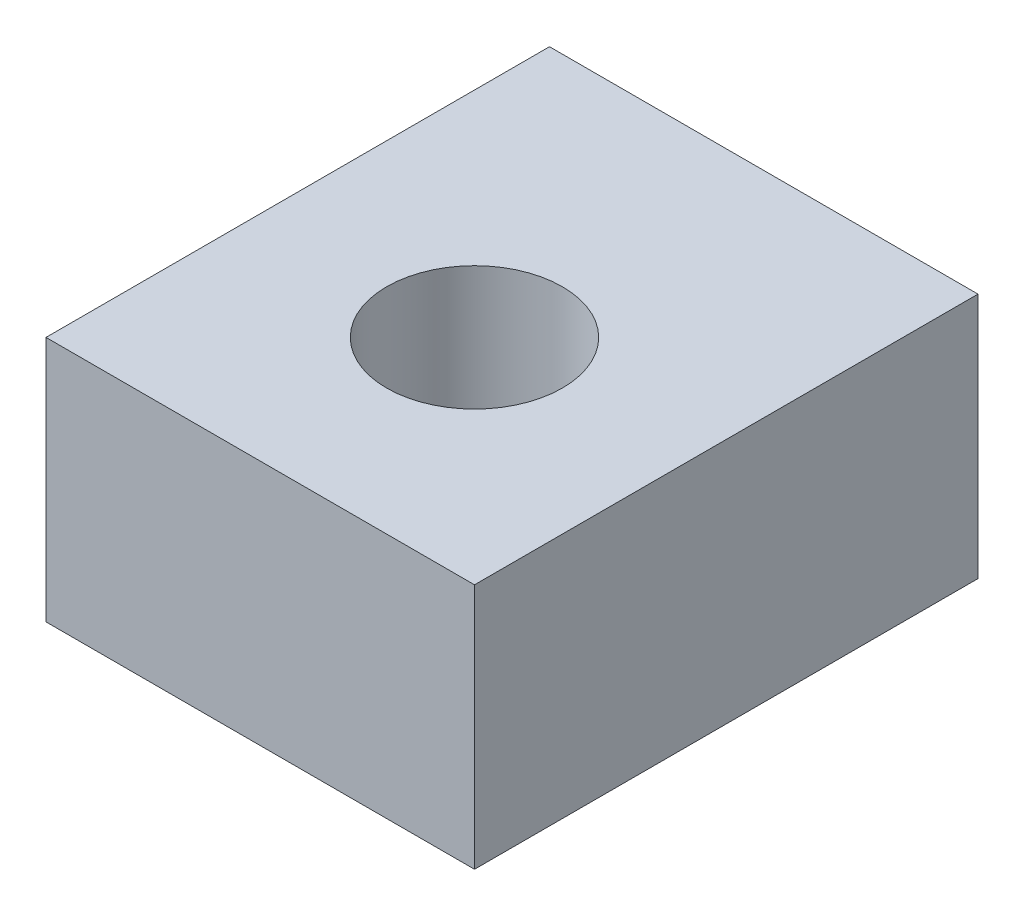
ISO-10303-21;
HEADER;
FILE_DESCRIPTION(('STEP AP214'),'2;1');
FILE_NAME('part.step','',(''),(''),'','','');
FILE_SCHEMA(('AUTOMOTIVE_DESIGN { 1 0 10303 214 1 1 1 1 }'));
ENDSEC;
DATA;
#1=APPLICATION_CONTEXT('core data for automotive mechanical design processes');
#2=APPLICATION_PROTOCOL_DEFINITION('international standard','automotive_design',2000,#1);
#3=PRODUCT_CONTEXT('',#1,'mechanical');
#4=PRODUCT('Part','Part','',(#3));
#5=PRODUCT_RELATED_PRODUCT_CATEGORY('part','',(#4));
#6=PRODUCT_DEFINITION_FORMATION('','',#4);
#7=PRODUCT_DEFINITION_CONTEXT('part definition',#1,'design');
#8=PRODUCT_DEFINITION('design','',#6,#7);
#9=PRODUCT_DEFINITION_SHAPE('','',#8);
#10=(LENGTH_UNIT() NAMED_UNIT(*) SI_UNIT(.MILLI.,.METRE.));
#11=(NAMED_UNIT(*) PLANE_ANGLE_UNIT() SI_UNIT($,.RADIAN.));
#12=(NAMED_UNIT(*) SI_UNIT($,.STERADIAN.) SOLID_ANGLE_UNIT());
#13=UNCERTAINTY_MEASURE_WITH_UNIT(LENGTH_MEASURE(1.E-05),#10,'distance_accuracy_value','');
#14=(GEOMETRIC_REPRESENTATION_CONTEXT(3) GLOBAL_UNCERTAINTY_ASSIGNED_CONTEXT((#13)) GLOBAL_UNIT_ASSIGNED_CONTEXT((#10,
#11,#12)) REPRESENTATION_CONTEXT('',''));
#15=CARTESIAN_POINT('',(0.,0.,0.));
#16=DIRECTION('',(0.,0.,1.));
#17=DIRECTION('',(1.,0.,0.));
#18=AXIS2_PLACEMENT_3D('',#15,#16,#17);
#19=CARTESIAN_POINT('',(0.,11.5,0.));
#20=DIRECTION('',(0.,-1.,0.));
#21=DIRECTION('',(0.,0.,-1.));
#22=AXIS2_PLACEMENT_3D('',#19,#20,#21);
#23=PLANE('',#22);
#24=DIRECTION('',(0.,0.,-1.));
#25=VECTOR('',#24,1.);
#26=CARTESIAN_POINT('',(10.,11.5,11.75));
#27=LINE('',#26,#25);
#28=CARTESIAN_POINT('',(10.,11.5,11.75));
#29=VERTEX_POINT('',#28);
#30=CARTESIAN_POINT('',(10.,11.5,-11.75));
#31=VERTEX_POINT('',#30);
#32=EDGE_CURVE('E85',#29,#31,#27,.T.);
#33=ORIENTED_EDGE('',*,*,#32,.T.);
#34=DIRECTION('',(-1.,0.,0.));
#35=VECTOR('',#34,1.);
#36=CARTESIAN_POINT('',(-10.,11.5,-11.75));
#37=LINE('',#36,#35);
#38=CARTESIAN_POINT('',(-10.,11.5,-11.75));
#39=VERTEX_POINT('',#38);
#40=EDGE_CURVE('E80',#31,#39,#37,.T.);
#41=ORIENTED_EDGE('',*,*,#40,.T.);
#42=DIRECTION('',(0.,0.,1.));
#43=VECTOR('',#42,1.);
#44=CARTESIAN_POINT('',(-10.,11.5,11.75));
#45=LINE('',#44,#43);
#46=CARTESIAN_POINT('',(-10.,11.5,11.75));
#47=VERTEX_POINT('',#46);
#48=EDGE_CURVE('E83',#39,#47,#45,.T.);
#49=ORIENTED_EDGE('',*,*,#48,.T.);
#50=DIRECTION('',(1.,0.,0.));
#51=VECTOR('',#50,1.);
#52=CARTESIAN_POINT('',(-10.,11.5,11.75));
#53=LINE('',#52,#51);
#54=EDGE_CURVE('E50',#47,#29,#53,.T.);
#55=ORIENTED_EDGE('',*,*,#54,.T.);
#56=EDGE_LOOP('',(#33,#41,#49,#55));
#57=FACE_BOUND('',#56,.T.);
#58=CARTESIAN_POINT('',(0.,11.5,1.75));
#59=DIRECTION('',(0.,1.,0.));
#60=DIRECTION('',(0.,0.,1.));
#61=AXIS2_PLACEMENT_3D('',#58,#59,#60);
#62=CIRCLE('',#61,4.1);
#63=CARTESIAN_POINT('',(0.,11.5,5.85));
#64=VERTEX_POINT('',#63);
#65=EDGE_CURVE('E100',#64,#64,#62,.T.);
#66=ORIENTED_EDGE('',*,*,#65,.F.);
#67=EDGE_LOOP('',(#66));
#68=FACE_BOUND('',#67,.T.);
#69=ADVANCED_FACE('F33',(#57,#68),#23,.F.);
#70=CARTESIAN_POINT('',(0.,0.,0.));
#71=DIRECTION('',(0.,-1.,0.));
#72=DIRECTION('',(0.,0.,-1.));
#73=AXIS2_PLACEMENT_3D('',#70,#71,#72);
#74=PLANE('',#73);
#75=DIRECTION('',(0.,0.,-1.));
#76=VECTOR('',#75,1.);
#77=CARTESIAN_POINT('',(10.,0.,11.75));
#78=LINE('',#77,#76);
#79=CARTESIAN_POINT('',(10.,0.,11.75));
#80=VERTEX_POINT('',#79);
#81=CARTESIAN_POINT('',(10.,0.,-11.75));
#82=VERTEX_POINT('',#81);
#83=EDGE_CURVE('E97',#80,#82,#78,.T.);
#84=ORIENTED_EDGE('',*,*,#83,.F.);
#85=DIRECTION('',(1.,0.,0.));
#86=VECTOR('',#85,1.);
#87=CARTESIAN_POINT('',(-10.,0.,11.75));
#88=LINE('',#87,#86);
#89=CARTESIAN_POINT('',(-10.,0.,11.75));
#90=VERTEX_POINT('',#89);
#91=EDGE_CURVE('E73',#90,#80,#88,.T.);
#92=ORIENTED_EDGE('',*,*,#91,.F.);
#93=DIRECTION('',(0.,0.,1.));
#94=VECTOR('',#93,1.);
#95=CARTESIAN_POINT('',(-10.,0.,11.75));
#96=LINE('',#95,#94);
#97=CARTESIAN_POINT('',(-10.,0.,-11.75));
#98=VERTEX_POINT('',#97);
#99=EDGE_CURVE('E67',#98,#90,#96,.T.);
#100=ORIENTED_EDGE('',*,*,#99,.F.);
#101=DIRECTION('',(-1.,0.,0.));
#102=VECTOR('',#101,1.);
#103=CARTESIAN_POINT('',(-10.,0.,-11.75));
#104=LINE('',#103,#102);
#105=EDGE_CURVE('E89',#82,#98,#104,.T.);
#106=ORIENTED_EDGE('',*,*,#105,.F.);
#107=EDGE_LOOP('',(#84,#92,#100,#106));
#108=FACE_BOUND('',#107,.T.);
#109=CARTESIAN_POINT('',(0.,0.,1.75));
#110=DIRECTION('',(0.,1.,0.));
#111=DIRECTION('',(0.,0.,1.));
#112=AXIS2_PLACEMENT_3D('',#109,#110,#111);
#113=CIRCLE('',#112,4.1);
#114=CARTESIAN_POINT('',(0.,0.,5.85));
#115=VERTEX_POINT('',#114);
#116=EDGE_CURVE('E112',#115,#115,#113,.T.);
#117=ORIENTED_EDGE('',*,*,#116,.T.);
#118=EDGE_LOOP('',(#117));
#119=FACE_BOUND('',#118,.T.);
#120=ADVANCED_FACE('F108',(#108,#119),#74,.T.);
#121=CARTESIAN_POINT('',(10.,11.5,11.75));
#122=DIRECTION('',(-1.,0.,0.));
#123=DIRECTION('',(0.,0.,1.));
#124=AXIS2_PLACEMENT_3D('',#121,#122,#123);
#125=PLANE('',#124);
#126=ORIENTED_EDGE('',*,*,#83,.T.);
#127=DIRECTION('',(0.,-1.,0.));
#128=VECTOR('',#127,1.);
#129=CARTESIAN_POINT('',(10.,11.5,-11.75));
#130=LINE('',#129,#128);
#131=EDGE_CURVE('E11',#31,#82,#130,.T.);
#132=ORIENTED_EDGE('',*,*,#131,.F.);
#133=ORIENTED_EDGE('',*,*,#32,.F.);
#134=DIRECTION('',(0.,-1.,0.));
#135=VECTOR('',#134,1.);
#136=CARTESIAN_POINT('',(10.,11.5,11.75));
#137=LINE('',#136,#135);
#138=EDGE_CURVE('E93',#29,#80,#137,.T.);
#139=ORIENTED_EDGE('',*,*,#138,.T.);
#140=EDGE_LOOP('',(#126,#132,#133,#139));
#141=FACE_BOUND('',#140,.T.);
#142=ADVANCED_FACE('F35',(#141),#125,.F.);
#143=CARTESIAN_POINT('',(-10.,11.5,-11.75));
#144=DIRECTION('',(0.,0.,1.));
#145=DIRECTION('',(1.,0.,0.));
#146=AXIS2_PLACEMENT_3D('',#143,#144,#145);
#147=PLANE('',#146);
#148=ORIENTED_EDGE('',*,*,#105,.T.);
#149=DIRECTION('',(0.,-1.,0.));
#150=VECTOR('',#149,1.);
#151=CARTESIAN_POINT('',(-10.,11.5,-11.75));
#152=LINE('',#151,#150);
#153=EDGE_CURVE('E42',#39,#98,#152,.T.);
#154=ORIENTED_EDGE('',*,*,#153,.F.);
#155=ORIENTED_EDGE('',*,*,#40,.F.);
#156=ORIENTED_EDGE('',*,*,#131,.T.);
#157=EDGE_LOOP('',(#148,#154,#155,#156));
#158=FACE_BOUND('',#157,.T.);
#159=ADVANCED_FACE('F88',(#158),#147,.F.);
#160=CARTESIAN_POINT('',(-10.,11.5,11.75));
#161=DIRECTION('',(1.,0.,0.));
#162=DIRECTION('',(0.,0.,-1.));
#163=AXIS2_PLACEMENT_3D('',#160,#161,#162);
#164=PLANE('',#163);
#165=ORIENTED_EDGE('',*,*,#99,.T.);
#166=DIRECTION('',(0.,-1.,0.));
#167=VECTOR('',#166,1.);
#168=CARTESIAN_POINT('',(-10.,11.5,11.75));
#169=LINE('',#168,#167);
#170=EDGE_CURVE('E90',#47,#90,#169,.T.);
#171=ORIENTED_EDGE('',*,*,#170,.F.);
#172=ORIENTED_EDGE('',*,*,#48,.F.);
#173=ORIENTED_EDGE('',*,*,#153,.T.);
#174=EDGE_LOOP('',(#165,#171,#172,#173));
#175=FACE_BOUND('',#174,.T.);
#176=ADVANCED_FACE('F91',(#175),#164,.F.);
#177=CARTESIAN_POINT('',(-10.,11.5,11.75));
#178=DIRECTION('',(0.,0.,-1.));
#179=DIRECTION('',(-1.,0.,0.));
#180=AXIS2_PLACEMENT_3D('',#177,#178,#179);
#181=PLANE('',#180);
#182=ORIENTED_EDGE('',*,*,#91,.T.);
#183=ORIENTED_EDGE('',*,*,#138,.F.);
#184=ORIENTED_EDGE('',*,*,#54,.F.);
#185=ORIENTED_EDGE('',*,*,#170,.T.);
#186=EDGE_LOOP('',(#182,#183,#184,#185));
#187=FACE_BOUND('',#186,.T.);
#188=ADVANCED_FACE('F105',(#187),#181,.F.);
#189=CARTESIAN_POINT('',(0.,11.5,1.75));
#190=DIRECTION('',(0.,-1.,0.));
#191=DIRECTION('',(0.,0.,-1.));
#192=AXIS2_PLACEMENT_3D('',#189,#190,#191);
#193=CYLINDRICAL_SURFACE('',#192,4.1);
#194=ORIENTED_EDGE('',*,*,#65,.T.);
#195=EDGE_LOOP('',(#194));
#196=FACE_BOUND('',#195,.T.);
#197=ORIENTED_EDGE('',*,*,#116,.F.);
#198=EDGE_LOOP('',(#197));
#199=FACE_BOUND('',#198,.T.);
#200=ADVANCED_FACE('F118',(#196,#199),#193,.F.);
#201=CLOSED_SHELL('',(#69,#120,#142,#159,#176,#188,#200));
#202=MANIFOLD_SOLID_BREP('B2',#201);
#203=ADVANCED_BREP_SHAPE_REPRESENTATION('',(#18,#202),#14);
#204=SHAPE_DEFINITION_REPRESENTATION(#9,#203);
ENDSEC;
END-ISO-10303-21;
